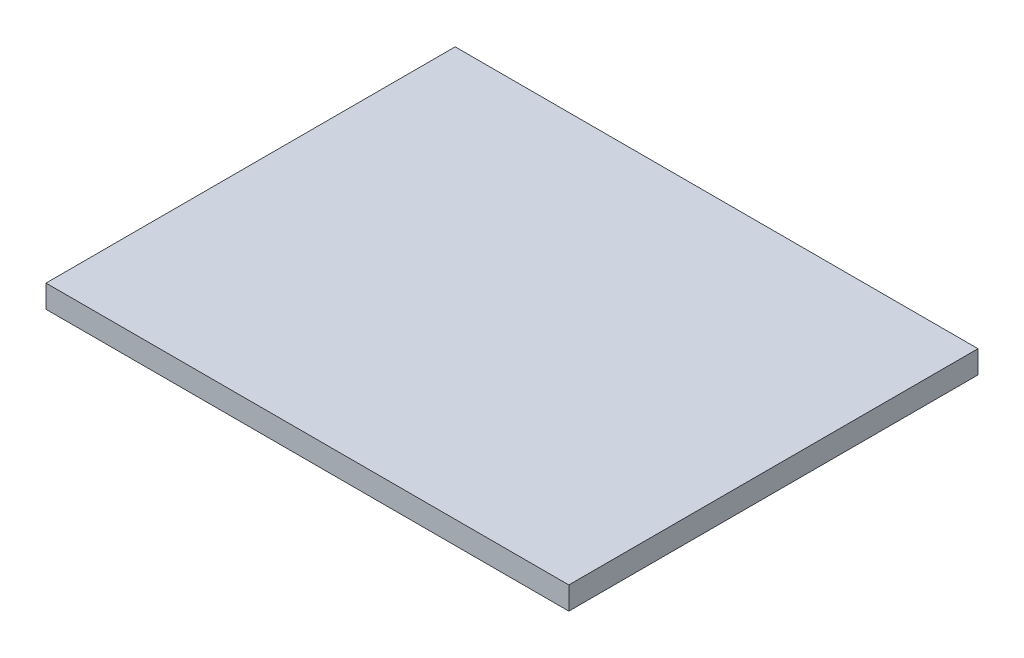
ISO-10303-21;
HEADER;
FILE_DESCRIPTION(('STEP AP214'),'2;1');
FILE_NAME('part.step','',(''),(''),'','','');
FILE_SCHEMA(('AUTOMOTIVE_DESIGN { 1 0 10303 214 1 1 1 1 }'));
ENDSEC;
DATA;
#1=APPLICATION_CONTEXT('core data for automotive mechanical design processes');
#2=APPLICATION_PROTOCOL_DEFINITION('international standard','automotive_design',2000,#1);
#3=PRODUCT_CONTEXT('',#1,'mechanical');
#4=PRODUCT('Part','Part','',(#3));
#5=PRODUCT_RELATED_PRODUCT_CATEGORY('part','',(#4));
#6=PRODUCT_DEFINITION_FORMATION('','',#4);
#7=PRODUCT_DEFINITION_CONTEXT('part definition',#1,'design');
#8=PRODUCT_DEFINITION('design','',#6,#7);
#9=PRODUCT_DEFINITION_SHAPE('','',#8);
#10=(LENGTH_UNIT() NAMED_UNIT(*) SI_UNIT(.MILLI.,.METRE.));
#11=(NAMED_UNIT(*) PLANE_ANGLE_UNIT() SI_UNIT($,.RADIAN.));
#12=(NAMED_UNIT(*) SI_UNIT($,.STERADIAN.) SOLID_ANGLE_UNIT());
#13=UNCERTAINTY_MEASURE_WITH_UNIT(LENGTH_MEASURE(1.E-05),#10,'distance_accuracy_value','');
#14=(GEOMETRIC_REPRESENTATION_CONTEXT(3) GLOBAL_UNCERTAINTY_ASSIGNED_CONTEXT((#13)) GLOBAL_UNIT_ASSIGNED_CONTEXT((#10,
#11,#12)) REPRESENTATION_CONTEXT('',''));
#15=CARTESIAN_POINT('',(0.,0.,0.));
#16=DIRECTION('',(0.,0.,1.));
#17=DIRECTION('',(1.,0.,0.));
#18=AXIS2_PLACEMENT_3D('',#15,#16,#17);
#19=CARTESIAN_POINT('',(57.5,5.,45.));
#20=DIRECTION('',(-1.,0.,0.));
#21=DIRECTION('',(0.,0.,1.));
#22=AXIS2_PLACEMENT_3D('',#19,#20,#21);
#23=PLANE('',#22);
#24=DIRECTION('',(0.,0.,-1.));
#25=VECTOR('',#24,1.);
#26=CARTESIAN_POINT('',(57.5,0.,45.));
#27=LINE('',#26,#25);
#28=CARTESIAN_POINT('',(57.5,0.,45.));
#29=VERTEX_POINT('',#28);
#30=CARTESIAN_POINT('',(57.5,0.,-45.));
#31=VERTEX_POINT('',#30);
#32=EDGE_CURVE('E96',#29,#31,#27,.T.);
#33=ORIENTED_EDGE('',*,*,#32,.T.);
#34=DIRECTION('',(0.,-1.,0.));
#35=VECTOR('',#34,1.);
#36=CARTESIAN_POINT('',(57.5,5.,-45.));
#37=LINE('',#36,#35);
#38=CARTESIAN_POINT('',(57.5,5.,-45.));
#39=VERTEX_POINT('',#38);
#40=EDGE_CURVE('E11',#39,#31,#37,.T.);
#41=ORIENTED_EDGE('',*,*,#40,.F.);
#42=DIRECTION('',(0.,0.,-1.));
#43=VECTOR('',#42,1.);
#44=CARTESIAN_POINT('',(57.5,5.,45.));
#45=LINE('',#44,#43);
#46=CARTESIAN_POINT('',(57.5,5.,45.));
#47=VERTEX_POINT('',#46);
#48=EDGE_CURVE('E84',#47,#39,#45,.T.);
#49=ORIENTED_EDGE('',*,*,#48,.F.);
#50=DIRECTION('',(0.,-1.,0.));
#51=VECTOR('',#50,1.);
#52=CARTESIAN_POINT('',(57.5,5.,45.));
#53=LINE('',#52,#51);
#54=EDGE_CURVE('E92',#47,#29,#53,.T.);
#55=ORIENTED_EDGE('',*,*,#54,.T.);
#56=EDGE_LOOP('',(#33,#41,#49,#55));
#57=FACE_BOUND('',#56,.T.);
#58=ADVANCED_FACE('F33',(#57),#23,.F.);
#59=CARTESIAN_POINT('',(-57.5,5.,-45.));
#60=DIRECTION('',(0.,0.,1.));
#61=DIRECTION('',(1.,0.,0.));
#62=AXIS2_PLACEMENT_3D('',#59,#60,#61);
#63=PLANE('',#62);
#64=DIRECTION('',(-1.,0.,0.));
#65=VECTOR('',#64,1.);
#66=CARTESIAN_POINT('',(-57.5,0.,-45.));
#67=LINE('',#66,#65);
#68=CARTESIAN_POINT('',(-57.5,0.,-45.));
#69=VERTEX_POINT('',#68);
#70=EDGE_CURVE('E88',#31,#69,#67,.T.);
#71=ORIENTED_EDGE('',*,*,#70,.T.);
#72=DIRECTION('',(0.,-1.,0.));
#73=VECTOR('',#72,1.);
#74=CARTESIAN_POINT('',(-57.5,5.,-45.));
#75=LINE('',#74,#73);
#76=CARTESIAN_POINT('',(-57.5,5.,-45.));
#77=VERTEX_POINT('',#76);
#78=EDGE_CURVE('E41',#77,#69,#75,.T.);
#79=ORIENTED_EDGE('',*,*,#78,.F.);
#80=DIRECTION('',(-1.,0.,0.));
#81=VECTOR('',#80,1.);
#82=CARTESIAN_POINT('',(-57.5,5.,-45.));
#83=LINE('',#82,#81);
#84=EDGE_CURVE('E79',#39,#77,#83,.T.);
#85=ORIENTED_EDGE('',*,*,#84,.F.);
#86=ORIENTED_EDGE('',*,*,#40,.T.);
#87=EDGE_LOOP('',(#71,#79,#85,#86));
#88=FACE_BOUND('',#87,.T.);
#89=ADVANCED_FACE('F87',(#88),#63,.F.);
#90=CARTESIAN_POINT('',(-57.5,5.,45.));
#91=DIRECTION('',(1.,0.,0.));
#92=DIRECTION('',(0.,0.,-1.));
#93=AXIS2_PLACEMENT_3D('',#90,#91,#92);
#94=PLANE('',#93);
#95=DIRECTION('',(0.,0.,1.));
#96=VECTOR('',#95,1.);
#97=CARTESIAN_POINT('',(-57.5,0.,45.));
#98=LINE('',#97,#96);
#99=CARTESIAN_POINT('',(-57.5,0.,45.));
#100=VERTEX_POINT('',#99);
#101=EDGE_CURVE('E66',#69,#100,#98,.T.);
#102=ORIENTED_EDGE('',*,*,#101,.T.);
#103=DIRECTION('',(0.,-1.,0.));
#104=VECTOR('',#103,1.);
#105=CARTESIAN_POINT('',(-57.5,5.,45.));
#106=LINE('',#105,#104);
#107=CARTESIAN_POINT('',(-57.5,5.,45.));
#108=VERTEX_POINT('',#107);
#109=EDGE_CURVE('E89',#108,#100,#106,.T.);
#110=ORIENTED_EDGE('',*,*,#109,.F.);
#111=DIRECTION('',(0.,0.,1.));
#112=VECTOR('',#111,1.);
#113=CARTESIAN_POINT('',(-57.5,5.,45.));
#114=LINE('',#113,#112);
#115=EDGE_CURVE('E82',#77,#108,#114,.T.);
#116=ORIENTED_EDGE('',*,*,#115,.F.);
#117=ORIENTED_EDGE('',*,*,#78,.T.);
#118=EDGE_LOOP('',(#102,#110,#116,#117));
#119=FACE_BOUND('',#118,.T.);
#120=ADVANCED_FACE('F90',(#119),#94,.F.);
#121=CARTESIAN_POINT('',(-57.5,5.,45.));
#122=DIRECTION('',(0.,0.,-1.));
#123=DIRECTION('',(-1.,0.,0.));
#124=AXIS2_PLACEMENT_3D('',#121,#122,#123);
#125=PLANE('',#124);
#126=DIRECTION('',(1.,0.,0.));
#127=VECTOR('',#126,1.);
#128=CARTESIAN_POINT('',(-57.5,0.,45.));
#129=LINE('',#128,#127);
#130=EDGE_CURVE('E72',#100,#29,#129,.T.);
#131=ORIENTED_EDGE('',*,*,#130,.T.);
#132=ORIENTED_EDGE('',*,*,#54,.F.);
#133=DIRECTION('',(1.,0.,0.));
#134=VECTOR('',#133,1.);
#135=CARTESIAN_POINT('',(-57.5,5.,45.));
#136=LINE('',#135,#134);
#137=EDGE_CURVE('E49',#108,#47,#136,.T.);
#138=ORIENTED_EDGE('',*,*,#137,.F.);
#139=ORIENTED_EDGE('',*,*,#109,.T.);
#140=EDGE_LOOP('',(#131,#132,#138,#139));
#141=FACE_BOUND('',#140,.T.);
#142=ADVANCED_FACE('F103',(#141),#125,.F.);
#143=CARTESIAN_POINT('',(57.5,5.,-45.));
#144=DIRECTION('',(0.,-1.,0.));
#145=DIRECTION('',(0.,0.,-1.));
#146=AXIS2_PLACEMENT_3D('',#143,#144,#145);
#147=PLANE('',#146);
#148=ORIENTED_EDGE('',*,*,#48,.T.);
#149=ORIENTED_EDGE('',*,*,#84,.T.);
#150=ORIENTED_EDGE('',*,*,#115,.T.);
#151=ORIENTED_EDGE('',*,*,#137,.T.);
#152=EDGE_LOOP('',(#148,#149,#150,#151));
#153=FACE_BOUND('',#152,.T.);
#154=ADVANCED_FACE('F80',(#153),#147,.F.);
#155=CARTESIAN_POINT('',(57.5,0.,-45.));
#156=DIRECTION('',(0.,-1.,0.));
#157=DIRECTION('',(0.,0.,-1.));
#158=AXIS2_PLACEMENT_3D('',#155,#156,#157);
#159=PLANE('',#158);
#160=ORIENTED_EDGE('',*,*,#32,.F.);
#161=ORIENTED_EDGE('',*,*,#130,.F.);
#162=ORIENTED_EDGE('',*,*,#101,.F.);
#163=ORIENTED_EDGE('',*,*,#70,.F.);
#164=EDGE_LOOP('',(#160,#161,#162,#163));
#165=FACE_BOUND('',#164,.T.);
#166=ADVANCED_FACE('F106',(#165),#159,.T.);
#167=CLOSED_SHELL('',(#58,#89,#120,#142,#154,#166));
#168=MANIFOLD_SOLID_BREP('B2',#167);
#169=ADVANCED_BREP_SHAPE_REPRESENTATION('',(#18,#168),#14);
#170=SHAPE_DEFINITION_REPRESENTATION(#9,#169);
ENDSEC;
END-ISO-10303-21;
